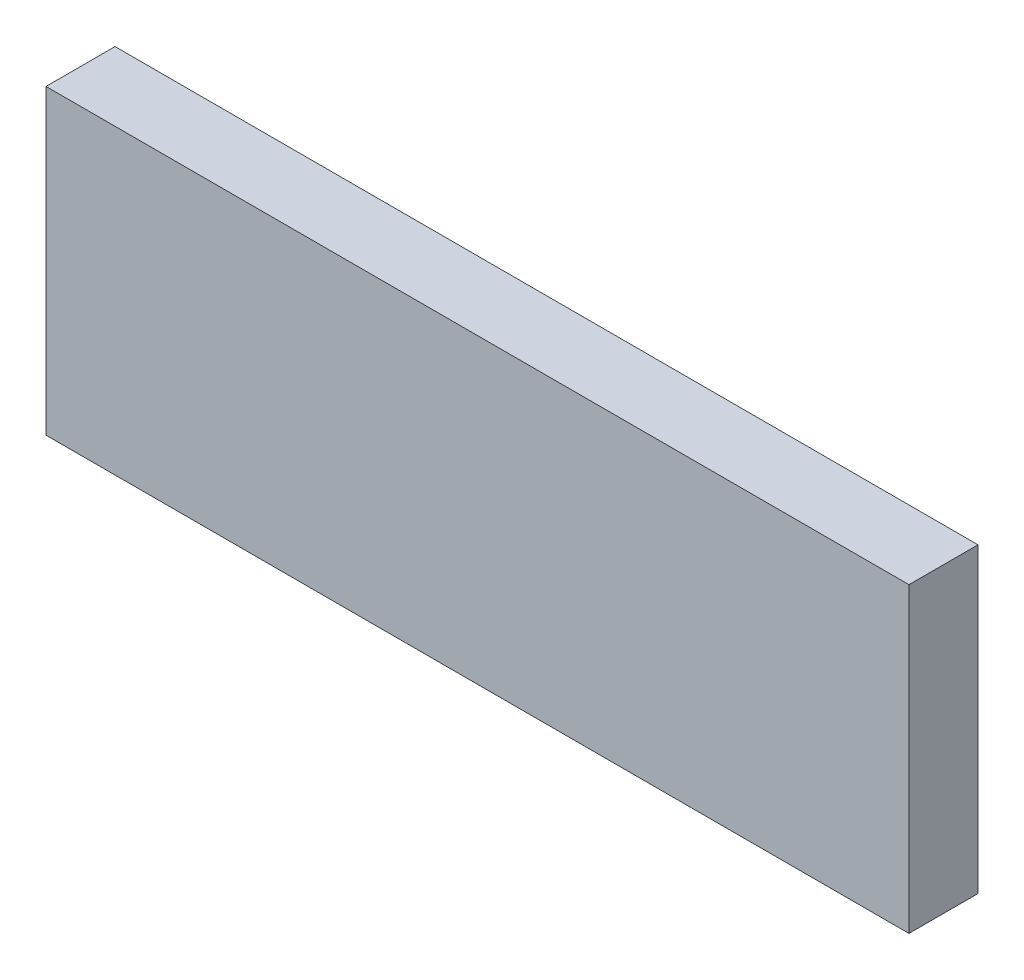
ISO-10303-21;
HEADER;
FILE_DESCRIPTION(('STEP AP214'),'2;1');
FILE_NAME('part.step','',(''),(''),'','','');
FILE_SCHEMA(('AUTOMOTIVE_DESIGN { 1 0 10303 214 1 1 1 1 }'));
ENDSEC;
DATA;
#1=APPLICATION_CONTEXT('core data for automotive mechanical design processes');
#2=APPLICATION_PROTOCOL_DEFINITION('international standard','automotive_design',2000,#1);
#3=PRODUCT_CONTEXT('',#1,'mechanical');
#4=PRODUCT('Part','Part','',(#3));
#5=PRODUCT_RELATED_PRODUCT_CATEGORY('part','',(#4));
#6=PRODUCT_DEFINITION_FORMATION('','',#4);
#7=PRODUCT_DEFINITION_CONTEXT('part definition',#1,'design');
#8=PRODUCT_DEFINITION('design','',#6,#7);
#9=PRODUCT_DEFINITION_SHAPE('','',#8);
#10=(LENGTH_UNIT() NAMED_UNIT(*) SI_UNIT(.MILLI.,.METRE.));
#11=(NAMED_UNIT(*) PLANE_ANGLE_UNIT() SI_UNIT($,.RADIAN.));
#12=(NAMED_UNIT(*) SI_UNIT($,.STERADIAN.) SOLID_ANGLE_UNIT());
#13=UNCERTAINTY_MEASURE_WITH_UNIT(LENGTH_MEASURE(1.E-05),#10,'distance_accuracy_value','');
#14=(GEOMETRIC_REPRESENTATION_CONTEXT(3) GLOBAL_UNCERTAINTY_ASSIGNED_CONTEXT((#13)) GLOBAL_UNIT_ASSIGNED_CONTEXT((#10,
#11,#12)) REPRESENTATION_CONTEXT('',''));
#15=CARTESIAN_POINT('',(0.,0.,0.));
#16=DIRECTION('',(0.,0.,1.));
#17=DIRECTION('',(1.,0.,0.));
#18=AXIS2_PLACEMENT_3D('',#15,#16,#17);
#19=CARTESIAN_POINT('',(0.,0.,16.));
#20=DIRECTION('',(1.,0.,0.));
#21=DIRECTION('',(0.,0.,-1.));
#22=AXIS2_PLACEMENT_3D('',#19,#20,#21);
#23=PLANE('',#22);
#24=DIRECTION('',(0.,-1.,0.));
#25=VECTOR('',#24,1.);
#26=CARTESIAN_POINT('',(0.,0.,0.));
#27=LINE('',#26,#25);
#28=CARTESIAN_POINT('',(0.,70.,0.));
#29=VERTEX_POINT('',#28);
#30=CARTESIAN_POINT('',(0.,0.,0.));
#31=VERTEX_POINT('',#30);
#32=EDGE_CURVE('E95',#29,#31,#27,.T.);
#33=ORIENTED_EDGE('',*,*,#32,.T.);
#34=DIRECTION('',(0.,0.,-1.));
#35=VECTOR('',#34,1.);
#36=CARTESIAN_POINT('',(0.,0.,16.));
#37=LINE('',#36,#35);
#38=CARTESIAN_POINT('',(0.,0.,16.));
#39=VERTEX_POINT('',#38);
#40=EDGE_CURVE('E11',#39,#31,#37,.T.);
#41=ORIENTED_EDGE('',*,*,#40,.F.);
#42=DIRECTION('',(0.,-1.,0.));
#43=VECTOR('',#42,1.);
#44=CARTESIAN_POINT('',(0.,0.,16.));
#45=LINE('',#44,#43);
#46=CARTESIAN_POINT('',(0.,70.,16.));
#47=VERTEX_POINT('',#46);
#48=EDGE_CURVE('E83',#47,#39,#45,.T.);
#49=ORIENTED_EDGE('',*,*,#48,.F.);
#50=DIRECTION('',(0.,0.,-1.));
#51=VECTOR('',#50,1.);
#52=CARTESIAN_POINT('',(0.,70.,16.));
#53=LINE('',#52,#51);
#54=EDGE_CURVE('E91',#47,#29,#53,.T.);
#55=ORIENTED_EDGE('',*,*,#54,.T.);
#56=EDGE_LOOP('',(#33,#41,#49,#55));
#57=FACE_BOUND('',#56,.T.);
#58=ADVANCED_FACE('F32',(#57),#23,.F.);
#59=CARTESIAN_POINT('',(0.,0.,16.));
#60=DIRECTION('',(0.,1.,0.));
#61=DIRECTION('',(0.,0.,1.));
#62=AXIS2_PLACEMENT_3D('',#59,#60,#61);
#63=PLANE('',#62);
#64=DIRECTION('',(1.,0.,0.));
#65=VECTOR('',#64,1.);
#66=CARTESIAN_POINT('',(0.,0.,0.));
#67=LINE('',#66,#65);
#68=CARTESIAN_POINT('',(200.,0.,0.));
#69=VERTEX_POINT('',#68);
#70=EDGE_CURVE('E87',#31,#69,#67,.T.);
#71=ORIENTED_EDGE('',*,*,#70,.T.);
#72=DIRECTION('',(0.,0.,-1.));
#73=VECTOR('',#72,1.);
#74=CARTESIAN_POINT('',(200.,0.,16.));
#75=LINE('',#74,#73);
#76=CARTESIAN_POINT('',(200.,0.,16.));
#77=VERTEX_POINT('',#76);
#78=EDGE_CURVE('E40',#77,#69,#75,.T.);
#79=ORIENTED_EDGE('',*,*,#78,.F.);
#80=DIRECTION('',(1.,0.,0.));
#81=VECTOR('',#80,1.);
#82=CARTESIAN_POINT('',(0.,0.,16.));
#83=LINE('',#82,#81);
#84=EDGE_CURVE('E78',#39,#77,#83,.T.);
#85=ORIENTED_EDGE('',*,*,#84,.F.);
#86=ORIENTED_EDGE('',*,*,#40,.T.);
#87=EDGE_LOOP('',(#71,#79,#85,#86));
#88=FACE_BOUND('',#87,.T.);
#89=ADVANCED_FACE('F86',(#88),#63,.F.);
#90=CARTESIAN_POINT('',(200.,0.,16.));
#91=DIRECTION('',(-1.,0.,0.));
#92=DIRECTION('',(0.,0.,1.));
#93=AXIS2_PLACEMENT_3D('',#90,#91,#92);
#94=PLANE('',#93);
#95=DIRECTION('',(0.,1.,0.));
#96=VECTOR('',#95,1.);
#97=CARTESIAN_POINT('',(200.,0.,0.));
#98=LINE('',#97,#96);
#99=CARTESIAN_POINT('',(200.,70.,0.));
#100=VERTEX_POINT('',#99);
#101=EDGE_CURVE('E65',#69,#100,#98,.T.);
#102=ORIENTED_EDGE('',*,*,#101,.T.);
#103=DIRECTION('',(0.,0.,-1.));
#104=VECTOR('',#103,1.);
#105=CARTESIAN_POINT('',(200.,70.,16.));
#106=LINE('',#105,#104);
#107=CARTESIAN_POINT('',(200.,70.,16.));
#108=VERTEX_POINT('',#107);
#109=EDGE_CURVE('E88',#108,#100,#106,.T.);
#110=ORIENTED_EDGE('',*,*,#109,.F.);
#111=DIRECTION('',(0.,1.,0.));
#112=VECTOR('',#111,1.);
#113=CARTESIAN_POINT('',(200.,0.,16.));
#114=LINE('',#113,#112);
#115=EDGE_CURVE('E81',#77,#108,#114,.T.);
#116=ORIENTED_EDGE('',*,*,#115,.F.);
#117=ORIENTED_EDGE('',*,*,#78,.T.);
#118=EDGE_LOOP('',(#102,#110,#116,#117));
#119=FACE_BOUND('',#118,.T.);
#120=ADVANCED_FACE('F89',(#119),#94,.F.);
#121=CARTESIAN_POINT('',(0.,70.,16.));
#122=DIRECTION('',(0.,-1.,0.));
#123=DIRECTION('',(0.,0.,-1.));
#124=AXIS2_PLACEMENT_3D('',#121,#122,#123);
#125=PLANE('',#124);
#126=DIRECTION('',(-1.,0.,0.));
#127=VECTOR('',#126,1.);
#128=CARTESIAN_POINT('',(0.,70.,0.));
#129=LINE('',#128,#127);
#130=EDGE_CURVE('E71',#100,#29,#129,.T.);
#131=ORIENTED_EDGE('',*,*,#130,.T.);
#132=ORIENTED_EDGE('',*,*,#54,.F.);
#133=DIRECTION('',(-1.,0.,0.));
#134=VECTOR('',#133,1.);
#135=CARTESIAN_POINT('',(0.,70.,16.));
#136=LINE('',#135,#134);
#137=EDGE_CURVE('E48',#108,#47,#136,.T.);
#138=ORIENTED_EDGE('',*,*,#137,.F.);
#139=ORIENTED_EDGE('',*,*,#109,.T.);
#140=EDGE_LOOP('',(#131,#132,#138,#139));
#141=FACE_BOUND('',#140,.T.);
#142=ADVANCED_FACE('F102',(#141),#125,.F.);
#143=CARTESIAN_POINT('',(0.,0.,16.));
#144=DIRECTION('',(0.,0.,-1.));
#145=DIRECTION('',(-1.,0.,0.));
#146=AXIS2_PLACEMENT_3D('',#143,#144,#145);
#147=PLANE('',#146);
#148=ORIENTED_EDGE('',*,*,#48,.T.);
#149=ORIENTED_EDGE('',*,*,#84,.T.);
#150=ORIENTED_EDGE('',*,*,#115,.T.);
#151=ORIENTED_EDGE('',*,*,#137,.T.);
#152=EDGE_LOOP('',(#148,#149,#150,#151));
#153=FACE_BOUND('',#152,.T.);
#154=ADVANCED_FACE('F79',(#153),#147,.F.);
#155=CARTESIAN_POINT('',(0.,0.,0.));
#156=DIRECTION('',(0.,0.,-1.));
#157=DIRECTION('',(-1.,0.,0.));
#158=AXIS2_PLACEMENT_3D('',#155,#156,#157);
#159=PLANE('',#158);
#160=ORIENTED_EDGE('',*,*,#32,.F.);
#161=ORIENTED_EDGE('',*,*,#130,.F.);
#162=ORIENTED_EDGE('',*,*,#101,.F.);
#163=ORIENTED_EDGE('',*,*,#70,.F.);
#164=EDGE_LOOP('',(#160,#161,#162,#163));
#165=FACE_BOUND('',#164,.T.);
#166=ADVANCED_FACE('F105',(#165),#159,.T.);
#167=CLOSED_SHELL('',(#58,#89,#120,#142,#154,#166));
#168=MANIFOLD_SOLID_BREP('B2',#167);
#169=ADVANCED_BREP_SHAPE_REPRESENTATION('',(#18,#168),#14);
#170=SHAPE_DEFINITION_REPRESENTATION(#9,#169);
ENDSEC;
END-ISO-10303-21;
